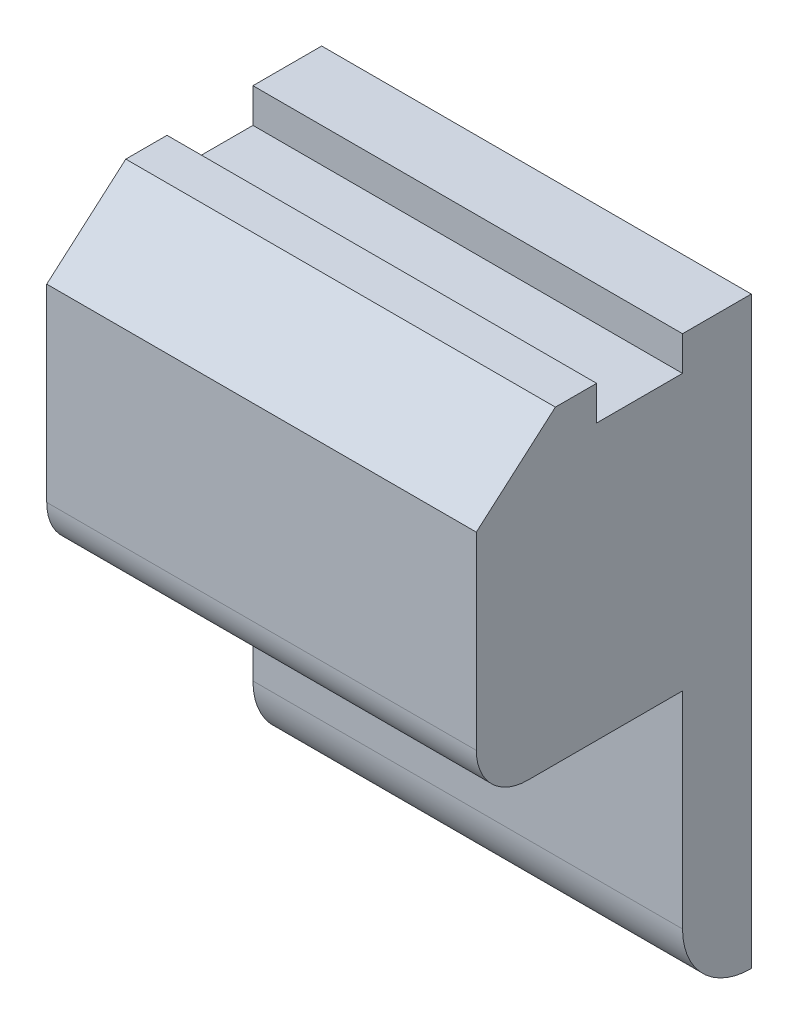
ISO-10303-21;
HEADER;
FILE_DESCRIPTION(('STEP AP214'),'2;1');
FILE_NAME('part.step','',(''),(''),'','','');
FILE_SCHEMA(('AUTOMOTIVE_DESIGN { 1 0 10303 214 1 1 1 1 }'));
ENDSEC;
DATA;
#1=APPLICATION_CONTEXT('core data for automotive mechanical design processes');
#2=APPLICATION_PROTOCOL_DEFINITION('international standard','automotive_design',2000,#1);
#3=PRODUCT_CONTEXT('',#1,'mechanical');
#4=PRODUCT('Part','Part','',(#3));
#5=PRODUCT_RELATED_PRODUCT_CATEGORY('part','',(#4));
#6=PRODUCT_DEFINITION_FORMATION('','',#4);
#7=PRODUCT_DEFINITION_CONTEXT('part definition',#1,'design');
#8=PRODUCT_DEFINITION('design','',#6,#7);
#9=PRODUCT_DEFINITION_SHAPE('','',#8);
#10=(LENGTH_UNIT() NAMED_UNIT(*) SI_UNIT(.MILLI.,.METRE.));
#11=(NAMED_UNIT(*) PLANE_ANGLE_UNIT() SI_UNIT($,.RADIAN.));
#12=(NAMED_UNIT(*) SI_UNIT($,.STERADIAN.) SOLID_ANGLE_UNIT());
#13=UNCERTAINTY_MEASURE_WITH_UNIT(LENGTH_MEASURE(1.E-05),#10,'distance_accuracy_value','');
#14=(GEOMETRIC_REPRESENTATION_CONTEXT(3) GLOBAL_UNCERTAINTY_ASSIGNED_CONTEXT((#13)) GLOBAL_UNIT_ASSIGNED_CONTEXT((#10,
#11,#12)) REPRESENTATION_CONTEXT('',''));
#15=CARTESIAN_POINT('',(0.,0.,0.));
#16=DIRECTION('',(0.,0.,1.));
#17=DIRECTION('',(1.,0.,0.));
#18=AXIS2_PLACEMENT_3D('',#15,#16,#17);
#19=CARTESIAN_POINT('',(6.25,0.,68.5));
#20=DIRECTION('',(0.,0.,1.));
#21=DIRECTION('',(1.,0.,0.));
#22=AXIS2_PLACEMENT_3D('',#19,#20,#21);
#23=PLANE('',#22);
#24=DIRECTION('',(0.,1.,0.));
#25=VECTOR('',#24,1.);
#26=CARTESIAN_POINT('',(-6.25,0.,68.5));
#27=LINE('',#26,#25);
#28=CARTESIAN_POINT('',(-6.25,-77.493005917904,68.5));
#29=VERTEX_POINT('',#28);
#30=CARTESIAN_POINT('',(-6.25,-71.493005917904,68.5));
#31=VERTEX_POINT('',#30);
#32=EDGE_CURVE('E178',#29,#31,#27,.T.);
#33=ORIENTED_EDGE('',*,*,#32,.F.);
#34=DIRECTION('',(-1.,0.,0.));
#35=VECTOR('',#34,1.);
#36=CARTESIAN_POINT('',(6.25,-77.493005917904,68.5));
#37=LINE('',#36,#35);
#38=CARTESIAN_POINT('',(6.25,-77.493005917904,68.5));
#39=VERTEX_POINT('',#38);
#40=EDGE_CURVE('E12',#29,#39,#37,.F.);
#41=ORIENTED_EDGE('',*,*,#40,.T.);
#42=DIRECTION('',(0.,1.,0.));
#43=VECTOR('',#42,1.);
#44=CARTESIAN_POINT('',(6.25,0.,68.5));
#45=LINE('',#44,#43);
#46=CARTESIAN_POINT('',(6.25,-71.493005917904,68.5));
#47=VERTEX_POINT('',#46);
#48=EDGE_CURVE('E175',#39,#47,#45,.T.);
#49=ORIENTED_EDGE('',*,*,#48,.T.);
#50=DIRECTION('',(-1.,0.,0.));
#51=VECTOR('',#50,1.);
#52=CARTESIAN_POINT('',(6.25,-71.493005917904,68.5));
#53=LINE('',#52,#51);
#54=EDGE_CURVE('E191',#47,#31,#53,.T.);
#55=ORIENTED_EDGE('',*,*,#54,.T.);
#56=EDGE_LOOP('',(#33,#41,#49,#55));
#57=FACE_BOUND('',#56,.T.);
#58=ADVANCED_FACE('F70',(#57),#23,.T.);
#59=CARTESIAN_POINT('',(6.25,-62.493005917904,0.));
#60=DIRECTION('',(0.,1.,0.));
#61=DIRECTION('',(0.,0.,1.));
#62=AXIS2_PLACEMENT_3D('',#59,#60,#61);
#63=PLANE('',#62);
#64=DIRECTION('',(1.,0.,0.));
#65=VECTOR('',#64,1.);
#66=CARTESIAN_POINT('',(6.25,-62.493005917904,66.5));
#67=LINE('',#66,#65);
#68=CARTESIAN_POINT('',(-6.25,-62.493005917904,66.5));
#69=VERTEX_POINT('',#68);
#70=CARTESIAN_POINT('',(6.25,-62.493005917904,66.5));
#71=VERTEX_POINT('',#70);
#72=EDGE_CURVE('E229',#69,#71,#67,.T.);
#73=ORIENTED_EDGE('',*,*,#72,.F.);
#74=DIRECTION('',(0.,0.,-1.));
#75=VECTOR('',#74,1.);
#76=CARTESIAN_POINT('',(-6.25,-62.493005917904,0.));
#77=LINE('',#76,#75);
#78=CARTESIAN_POINT('',(-6.25,-62.493005917904,68.5));
#79=VERTEX_POINT('',#78);
#80=EDGE_CURVE('E163',#79,#69,#77,.T.);
#81=ORIENTED_EDGE('',*,*,#80,.F.);
#82=DIRECTION('',(-1.,0.,0.));
#83=VECTOR('',#82,1.);
#84=CARTESIAN_POINT('',(6.25,-62.493005917904,68.5));
#85=LINE('',#84,#83);
#86=CARTESIAN_POINT('',(6.25,-62.493005917904,68.5));
#87=VERTEX_POINT('',#86);
#88=EDGE_CURVE('E171',#87,#79,#85,.T.);
#89=ORIENTED_EDGE('',*,*,#88,.F.);
#90=DIRECTION('',(0.,0.,-1.));
#91=VECTOR('',#90,1.);
#92=CARTESIAN_POINT('',(6.25,-62.493005917904,0.));
#93=LINE('',#92,#91);
#94=EDGE_CURVE('E180',#87,#71,#93,.T.);
#95=ORIENTED_EDGE('',*,*,#94,.T.);
#96=EDGE_LOOP('',(#73,#81,#89,#95));
#97=FACE_BOUND('',#96,.T.);
#98=ADVANCED_FACE('F247',(#97),#63,.T.);
#99=DIRECTION('',(-1.,0.,0.));
#100=VECTOR('',#99,1.);
#101=CARTESIAN_POINT('',(6.25,-63.493005917904,68.5));
#102=LINE('',#101,#100);
#103=CARTESIAN_POINT('',(6.25,-63.493005917904,68.5));
#104=VERTEX_POINT('',#103);
#105=CARTESIAN_POINT('',(-6.25,-63.493005917904,68.5));
#106=VERTEX_POINT('',#105);
#107=EDGE_CURVE('E194',#104,#106,#102,.T.);
#108=ORIENTED_EDGE('',*,*,#107,.F.);
#109=EDGE_CURVE('E184',#104,#87,#45,.T.);
#110=ORIENTED_EDGE('',*,*,#109,.T.);
#111=ORIENTED_EDGE('',*,*,#88,.T.);
#112=EDGE_CURVE('E181',#106,#79,#27,.T.);
#113=ORIENTED_EDGE('',*,*,#112,.F.);
#114=EDGE_LOOP('',(#108,#110,#111,#113));
#115=FACE_BOUND('',#114,.T.);
#116=ADVANCED_FACE('F286',(#115),#23,.T.);
#117=CARTESIAN_POINT('',(6.25,0.,0.));
#118=DIRECTION('',(1.,0.,0.));
#119=DIRECTION('',(0.,0.,-1.));
#120=AXIS2_PLACEMENT_3D('',#117,#118,#119);
#121=PLANE('',#120);
#122=DIRECTION('',(0.,-1.,0.));
#123=VECTOR('',#122,1.);
#124=CARTESIAN_POINT('',(6.25,0.,66.5));
#125=LINE('',#124,#123);
#126=CARTESIAN_POINT('',(6.25,-79.493005917904,66.5));
#127=VERTEX_POINT('',#126);
#128=EDGE_CURVE('E85',#71,#127,#125,.T.);
#129=ORIENTED_EDGE('',*,*,#128,.F.);
#130=ORIENTED_EDGE('',*,*,#94,.F.);
#131=ORIENTED_EDGE('',*,*,#109,.F.);
#132=DIRECTION('',(0.,0.,1.));
#133=VECTOR('',#132,1.);
#134=CARTESIAN_POINT('',(6.25,-63.493005917904,68.5));
#135=LINE('',#134,#133);
#136=CARTESIAN_POINT('',(6.25,-63.493005917904,71.));
#137=VERTEX_POINT('',#136);
#138=EDGE_CURVE('E237',#104,#137,#135,.T.);
#139=ORIENTED_EDGE('',*,*,#138,.T.);
#140=DIRECTION('',(0.,1.,0.));
#141=VECTOR('',#140,1.);
#142=CARTESIAN_POINT('',(6.25,-63.493005917904,71.));
#143=LINE('',#142,#141);
#144=CARTESIAN_POINT('',(6.25,-62.493005917904,71.));
#145=VERTEX_POINT('',#144);
#146=EDGE_CURVE('E235',#137,#145,#143,.T.);
#147=ORIENTED_EDGE('',*,*,#146,.T.);
#148=DIRECTION('',(0.,0.,1.));
#149=VECTOR('',#148,1.);
#150=CARTESIAN_POINT('',(6.25,-62.493005917904,71.));
#151=LINE('',#150,#149);
#152=CARTESIAN_POINT('',(6.25,-62.493005917904,72.2));
#153=VERTEX_POINT('',#152);
#154=EDGE_CURVE('E233',#145,#153,#151,.T.);
#155=ORIENTED_EDGE('',*,*,#154,.T.);
#156=DIRECTION('',(0.,-0.656178714924786,0.754605522163505));
#157=VECTOR('',#156,1.);
#158=CARTESIAN_POINT('',(6.25,-62.493005917904,72.2));
#159=LINE('',#158,#157);
#160=CARTESIAN_POINT('',(6.25,-64.493005917904,74.5));
#161=VERTEX_POINT('',#160);
#162=EDGE_CURVE('E231',#153,#161,#159,.T.);
#163=ORIENTED_EDGE('',*,*,#162,.T.);
#164=DIRECTION('',(0.,-1.,0.));
#165=VECTOR('',#164,1.);
#166=CARTESIAN_POINT('',(6.25,-64.493005917904,74.5));
#167=LINE('',#166,#165);
#168=CARTESIAN_POINT('',(6.25,-69.993005917904,74.5));
#169=VERTEX_POINT('',#168);
#170=EDGE_CURVE('E211',#161,#169,#167,.T.);
#171=ORIENTED_EDGE('',*,*,#170,.T.);
#172=CARTESIAN_POINT('',(6.25,-69.993005917904,73.));
#173=DIRECTION('',(1.,0.,0.));
#174=DIRECTION('',(0.,0.,-1.));
#175=AXIS2_PLACEMENT_3D('',#172,#173,#174);
#176=CIRCLE('',#175,1.5);
#177=CARTESIAN_POINT('',(6.25,-71.493005917904,73.));
#178=VERTEX_POINT('',#177);
#179=EDGE_CURVE('E214',#169,#178,#176,.T.);
#180=ORIENTED_EDGE('',*,*,#179,.T.);
#181=DIRECTION('',(0.,0.,-1.));
#182=VECTOR('',#181,1.);
#183=CARTESIAN_POINT('',(6.25,-71.493005917904,73.));
#184=LINE('',#183,#182);
#185=EDGE_CURVE('E239',#178,#47,#184,.T.);
#186=ORIENTED_EDGE('',*,*,#185,.T.);
#187=ORIENTED_EDGE('',*,*,#48,.F.);
#188=CARTESIAN_POINT('',(6.25,-77.493005917904,66.5));
#189=DIRECTION('',(1.,0.,0.));
#190=DIRECTION('',(0.,0.,-1.));
#191=AXIS2_PLACEMENT_3D('',#188,#189,#190);
#192=CIRCLE('',#191,2.);
#193=EDGE_CURVE('E170',#39,#127,#192,.T.);
#194=ORIENTED_EDGE('',*,*,#193,.T.);
#195=EDGE_LOOP('',(#129,#130,#131,#139,#147,#155,#163,#171,#180,#186,#187,#194));
#196=FACE_BOUND('',#195,.T.);
#197=ADVANCED_FACE('F250',(#196),#121,.T.);
#198=CARTESIAN_POINT('',(-6.25,0.,0.));
#199=DIRECTION('',(1.,0.,0.));
#200=DIRECTION('',(0.,0.,-1.));
#201=AXIS2_PLACEMENT_3D('',#198,#199,#200);
#202=PLANE('',#201);
#203=ORIENTED_EDGE('',*,*,#80,.T.);
#204=DIRECTION('',(0.,1.,0.));
#205=VECTOR('',#204,1.);
#206=CARTESIAN_POINT('',(-6.25,0.,66.5));
#207=LINE('',#206,#205);
#208=CARTESIAN_POINT('',(-6.25,-79.493005917904,66.5));
#209=VERTEX_POINT('',#208);
#210=EDGE_CURVE('E158',#209,#69,#207,.T.);
#211=ORIENTED_EDGE('',*,*,#210,.F.);
#212=CARTESIAN_POINT('',(-6.25,-77.493005917904,66.5));
#213=DIRECTION('',(1.,0.,0.));
#214=DIRECTION('',(0.,0.,-1.));
#215=AXIS2_PLACEMENT_3D('',#212,#213,#214);
#216=CIRCLE('',#215,2.);
#217=EDGE_CURVE('E161',#209,#29,#216,.F.);
#218=ORIENTED_EDGE('',*,*,#217,.T.);
#219=ORIENTED_EDGE('',*,*,#32,.T.);
#220=DIRECTION('',(0.,0.,-1.));
#221=VECTOR('',#220,1.);
#222=CARTESIAN_POINT('',(-6.25,-71.493005917904,73.));
#223=LINE('',#222,#221);
#224=CARTESIAN_POINT('',(-6.25,-71.493005917904,73.));
#225=VERTEX_POINT('',#224);
#226=EDGE_CURVE('E223',#225,#31,#223,.T.);
#227=ORIENTED_EDGE('',*,*,#226,.F.);
#228=CARTESIAN_POINT('',(-6.25,-69.993005917904,73.));
#229=DIRECTION('',(1.,0.,0.));
#230=DIRECTION('',(0.,0.,-1.));
#231=AXIS2_PLACEMENT_3D('',#228,#229,#230);
#232=CIRCLE('',#231,1.5);
#233=CARTESIAN_POINT('',(-6.25,-69.993005917904,74.5));
#234=VERTEX_POINT('',#233);
#235=EDGE_CURVE('E226',#234,#225,#232,.T.);
#236=ORIENTED_EDGE('',*,*,#235,.F.);
#237=DIRECTION('',(0.,-1.,0.));
#238=VECTOR('',#237,1.);
#239=CARTESIAN_POINT('',(-6.25,-64.493005917904,74.5));
#240=LINE('',#239,#238);
#241=CARTESIAN_POINT('',(-6.25,-64.493005917904,74.5));
#242=VERTEX_POINT('',#241);
#243=EDGE_CURVE('E212',#242,#234,#240,.T.);
#244=ORIENTED_EDGE('',*,*,#243,.F.);
#245=DIRECTION('',(0.,-0.656178714924786,0.754605522163505));
#246=VECTOR('',#245,1.);
#247=CARTESIAN_POINT('',(-6.25,-62.493005917904,72.2));
#248=LINE('',#247,#246);
#249=CARTESIAN_POINT('',(-6.25,-62.493005917904,72.2));
#250=VERTEX_POINT('',#249);
#251=EDGE_CURVE('E215',#250,#242,#248,.T.);
#252=ORIENTED_EDGE('',*,*,#251,.F.);
#253=DIRECTION('',(0.,0.,1.));
#254=VECTOR('',#253,1.);
#255=CARTESIAN_POINT('',(-6.25,-62.493005917904,71.));
#256=LINE('',#255,#254);
#257=CARTESIAN_POINT('',(-6.25,-62.493005917904,71.));
#258=VERTEX_POINT('',#257);
#259=EDGE_CURVE('E217',#258,#250,#256,.T.);
#260=ORIENTED_EDGE('',*,*,#259,.F.);
#261=DIRECTION('',(0.,1.,0.));
#262=VECTOR('',#261,1.);
#263=CARTESIAN_POINT('',(-6.25,-63.493005917904,71.));
#264=LINE('',#263,#262);
#265=CARTESIAN_POINT('',(-6.25,-63.493005917904,71.));
#266=VERTEX_POINT('',#265);
#267=EDGE_CURVE('E219',#266,#258,#264,.T.);
#268=ORIENTED_EDGE('',*,*,#267,.F.);
#269=DIRECTION('',(0.,0.,1.));
#270=VECTOR('',#269,1.);
#271=CARTESIAN_POINT('',(-6.25,-63.493005917904,68.5));
#272=LINE('',#271,#270);
#273=EDGE_CURVE('E221',#106,#266,#272,.T.);
#274=ORIENTED_EDGE('',*,*,#273,.F.);
#275=ORIENTED_EDGE('',*,*,#112,.T.);
#276=EDGE_LOOP('',(#203,#211,#218,#219,#227,#236,#244,#252,#260,#268,#274,#275));
#277=FACE_BOUND('',#276,.T.);
#278=ADVANCED_FACE('F159',(#277),#202,.F.);
#279=CARTESIAN_POINT('',(-1.25,0.,66.5));
#280=DIRECTION('',(0.,0.,1.));
#281=DIRECTION('',(1.,0.,0.));
#282=AXIS2_PLACEMENT_3D('',#279,#280,#281);
#283=PLANE('',#282);
#284=ORIENTED_EDGE('',*,*,#210,.T.);
#285=ORIENTED_EDGE('',*,*,#72,.T.);
#286=ORIENTED_EDGE('',*,*,#128,.T.);
#287=DIRECTION('',(-1.,0.,0.));
#288=VECTOR('',#287,1.);
#289=CARTESIAN_POINT('',(6.25,-79.493005917904,66.5));
#290=LINE('',#289,#288);
#291=EDGE_CURVE('E78',#127,#209,#290,.T.);
#292=ORIENTED_EDGE('',*,*,#291,.T.);
#293=EDGE_LOOP('',(#284,#285,#286,#292));
#294=FACE_BOUND('',#293,.T.);
#295=ADVANCED_FACE('F167',(#294),#283,.F.);
#296=CARTESIAN_POINT('',(6.25,-69.993005917904,73.));
#297=DIRECTION('',(-1.,0.,0.));
#298=DIRECTION('',(0.,0.,1.));
#299=AXIS2_PLACEMENT_3D('',#296,#297,#298);
#300=CYLINDRICAL_SURFACE('',#299,1.5);
#301=ORIENTED_EDGE('',*,*,#235,.T.);
#302=DIRECTION('',(-1.,0.,0.));
#303=VECTOR('',#302,1.);
#304=CARTESIAN_POINT('',(6.25,-71.493005917904,73.));
#305=LINE('',#304,#303);
#306=EDGE_CURVE('E188',#178,#225,#305,.T.);
#307=ORIENTED_EDGE('',*,*,#306,.F.);
#308=ORIENTED_EDGE('',*,*,#179,.F.);
#309=DIRECTION('',(-1.,0.,0.));
#310=VECTOR('',#309,1.);
#311=CARTESIAN_POINT('',(6.25,-69.993005917904,74.5));
#312=LINE('',#311,#310);
#313=EDGE_CURVE('E208',#169,#234,#312,.T.);
#314=ORIENTED_EDGE('',*,*,#313,.T.);
#315=EDGE_LOOP('',(#301,#307,#308,#314));
#316=FACE_BOUND('',#315,.T.);
#317=ADVANCED_FACE('F259',(#316),#300,.T.);
#318=CARTESIAN_POINT('',(6.25,-71.493005917904,73.));
#319=DIRECTION('',(0.,1.,0.));
#320=DIRECTION('',(0.,0.,1.));
#321=AXIS2_PLACEMENT_3D('',#318,#319,#320);
#322=PLANE('',#321);
#323=ORIENTED_EDGE('',*,*,#226,.T.);
#324=ORIENTED_EDGE('',*,*,#54,.F.);
#325=ORIENTED_EDGE('',*,*,#185,.F.);
#326=ORIENTED_EDGE('',*,*,#306,.T.);
#327=EDGE_LOOP('',(#323,#324,#325,#326));
#328=FACE_BOUND('',#327,.T.);
#329=ADVANCED_FACE('F253',(#328),#322,.F.);
#330=CARTESIAN_POINT('',(6.25,-63.493005917904,68.5));
#331=DIRECTION('',(0.,-1.,0.));
#332=DIRECTION('',(0.,0.,-1.));
#333=AXIS2_PLACEMENT_3D('',#330,#331,#332);
#334=PLANE('',#333);
#335=ORIENTED_EDGE('',*,*,#273,.T.);
#336=DIRECTION('',(-1.,0.,0.));
#337=VECTOR('',#336,1.);
#338=CARTESIAN_POINT('',(6.25,-63.493005917904,71.));
#339=LINE('',#338,#337);
#340=EDGE_CURVE('E196',#137,#266,#339,.T.);
#341=ORIENTED_EDGE('',*,*,#340,.F.);
#342=ORIENTED_EDGE('',*,*,#138,.F.);
#343=ORIENTED_EDGE('',*,*,#107,.T.);
#344=EDGE_LOOP('',(#335,#341,#342,#343));
#345=FACE_BOUND('',#344,.T.);
#346=ADVANCED_FACE('F282',(#345),#334,.F.);
#347=CARTESIAN_POINT('',(6.25,-63.493005917904,71.));
#348=DIRECTION('',(0.,0.,1.));
#349=DIRECTION('',(1.,0.,0.));
#350=AXIS2_PLACEMENT_3D('',#347,#348,#349);
#351=PLANE('',#350);
#352=ORIENTED_EDGE('',*,*,#267,.T.);
#353=DIRECTION('',(-1.,0.,0.));
#354=VECTOR('',#353,1.);
#355=CARTESIAN_POINT('',(6.25,-62.493005917904,71.));
#356=LINE('',#355,#354);
#357=EDGE_CURVE('E199',#145,#258,#356,.T.);
#358=ORIENTED_EDGE('',*,*,#357,.F.);
#359=ORIENTED_EDGE('',*,*,#146,.F.);
#360=ORIENTED_EDGE('',*,*,#340,.T.);
#361=EDGE_LOOP('',(#352,#358,#359,#360));
#362=FACE_BOUND('',#361,.T.);
#363=ADVANCED_FACE('F279',(#362),#351,.F.);
#364=CARTESIAN_POINT('',(6.25,-62.493005917904,71.));
#365=DIRECTION('',(0.,-1.,0.));
#366=DIRECTION('',(0.,0.,-1.));
#367=AXIS2_PLACEMENT_3D('',#364,#365,#366);
#368=PLANE('',#367);
#369=ORIENTED_EDGE('',*,*,#259,.T.);
#370=DIRECTION('',(-1.,0.,0.));
#371=VECTOR('',#370,1.);
#372=CARTESIAN_POINT('',(6.25,-62.493005917904,72.2));
#373=LINE('',#372,#371);
#374=EDGE_CURVE('E202',#153,#250,#373,.T.);
#375=ORIENTED_EDGE('',*,*,#374,.F.);
#376=ORIENTED_EDGE('',*,*,#154,.F.);
#377=ORIENTED_EDGE('',*,*,#357,.T.);
#378=EDGE_LOOP('',(#369,#375,#376,#377));
#379=FACE_BOUND('',#378,.T.);
#380=ADVANCED_FACE('F274',(#379),#368,.F.);
#381=CARTESIAN_POINT('',(6.25,-62.493005917904,72.2));
#382=DIRECTION('',(0.,-0.754605522163505,-0.656178714924786));
#383=DIRECTION('',(0.,0.656178714924786,-0.754605522163505));
#384=AXIS2_PLACEMENT_3D('',#381,#382,#383);
#385=PLANE('',#384);
#386=ORIENTED_EDGE('',*,*,#251,.T.);
#387=DIRECTION('',(-1.,0.,0.));
#388=VECTOR('',#387,1.);
#389=CARTESIAN_POINT('',(6.25,-64.493005917904,74.5));
#390=LINE('',#389,#388);
#391=EDGE_CURVE('E205',#161,#242,#390,.T.);
#392=ORIENTED_EDGE('',*,*,#391,.F.);
#393=ORIENTED_EDGE('',*,*,#162,.F.);
#394=ORIENTED_EDGE('',*,*,#374,.T.);
#395=EDGE_LOOP('',(#386,#392,#393,#394));
#396=FACE_BOUND('',#395,.T.);
#397=ADVANCED_FACE('F268',(#396),#385,.F.);
#398=CARTESIAN_POINT('',(6.25,-64.493005917904,74.5));
#399=DIRECTION('',(0.,0.,-1.));
#400=DIRECTION('',(-1.,0.,0.));
#401=AXIS2_PLACEMENT_3D('',#398,#399,#400);
#402=PLANE('',#401);
#403=ORIENTED_EDGE('',*,*,#243,.T.);
#404=ORIENTED_EDGE('',*,*,#313,.F.);
#405=ORIENTED_EDGE('',*,*,#170,.F.);
#406=ORIENTED_EDGE('',*,*,#391,.T.);
#407=EDGE_LOOP('',(#403,#404,#405,#406));
#408=FACE_BOUND('',#407,.T.);
#409=ADVANCED_FACE('F264',(#408),#402,.F.);
#410=CARTESIAN_POINT('',(6.25,-77.493005917904,66.5));
#411=DIRECTION('',(-1.,0.,0.));
#412=DIRECTION('',(0.,0.,1.));
#413=AXIS2_PLACEMENT_3D('',#410,#411,#412);
#414=CYLINDRICAL_SURFACE('',#413,2.);
#415=ORIENTED_EDGE('',*,*,#193,.F.);
#416=ORIENTED_EDGE('',*,*,#40,.F.);
#417=ORIENTED_EDGE('',*,*,#217,.F.);
#418=ORIENTED_EDGE('',*,*,#291,.F.);
#419=EDGE_LOOP('',(#415,#416,#417,#418));
#420=FACE_BOUND('',#419,.T.);
#421=ADVANCED_FACE('F72',(#420),#414,.T.);
#422=CLOSED_SHELL('',(#58,#98,#116,#197,#278,#295,#317,#329,#346,#363,#380,#397,#409,#421));
#423=MANIFOLD_SOLID_BREP('B2',#422);
#424=ADVANCED_BREP_SHAPE_REPRESENTATION('',(#18,#423),#14);
#425=SHAPE_DEFINITION_REPRESENTATION(#9,#424);
ENDSEC;
END-ISO-10303-21;
